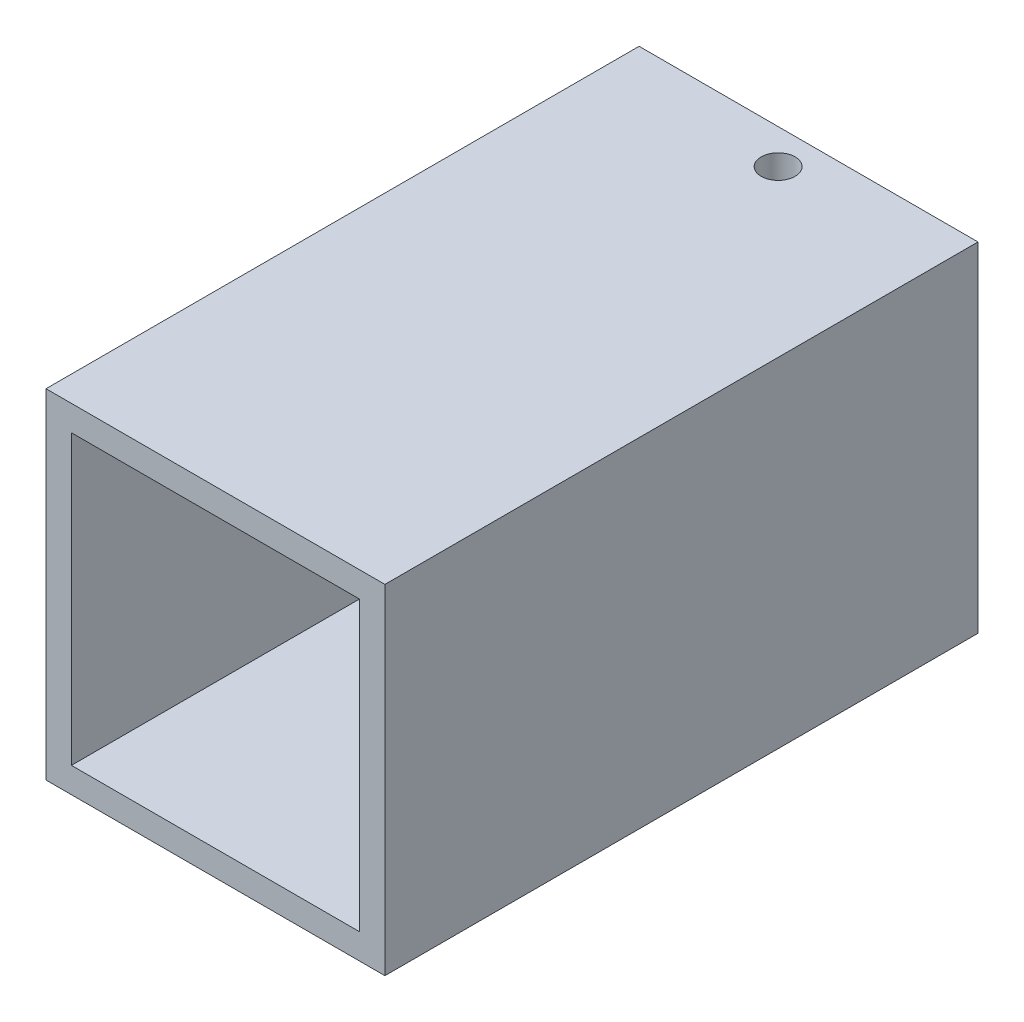
ISO-10303-21;
HEADER;
FILE_DESCRIPTION(('STEP AP214'),'2;1');
FILE_NAME('part.step','',(''),(''),'','','');
FILE_SCHEMA(('AUTOMOTIVE_DESIGN { 1 0 10303 214 1 1 1 1 }'));
ENDSEC;
DATA;
#1=APPLICATION_CONTEXT('core data for automotive mechanical design processes');
#2=APPLICATION_PROTOCOL_DEFINITION('international standard','automotive_design',2000,#1);
#3=PRODUCT_CONTEXT('',#1,'mechanical');
#4=PRODUCT('Part','Part','',(#3));
#5=PRODUCT_RELATED_PRODUCT_CATEGORY('part','',(#4));
#6=PRODUCT_DEFINITION_FORMATION('','',#4);
#7=PRODUCT_DEFINITION_CONTEXT('part definition',#1,'design');
#8=PRODUCT_DEFINITION('design','',#6,#7);
#9=PRODUCT_DEFINITION_SHAPE('','',#8);
#10=(LENGTH_UNIT() NAMED_UNIT(*) SI_UNIT(.MILLI.,.METRE.));
#11=(NAMED_UNIT(*) PLANE_ANGLE_UNIT() SI_UNIT($,.RADIAN.));
#12=(NAMED_UNIT(*) SI_UNIT($,.STERADIAN.) SOLID_ANGLE_UNIT());
#13=UNCERTAINTY_MEASURE_WITH_UNIT(LENGTH_MEASURE(1.E-05),#10,'distance_accuracy_value','');
#14=(GEOMETRIC_REPRESENTATION_CONTEXT(3) GLOBAL_UNCERTAINTY_ASSIGNED_CONTEXT((#13)) GLOBAL_UNIT_ASSIGNED_CONTEXT((#10,
#11,#12)) REPRESENTATION_CONTEXT('',''));
#15=CARTESIAN_POINT('',(0.,0.,0.));
#16=DIRECTION('',(0.,0.,1.));
#17=DIRECTION('',(1.,0.,0.));
#18=AXIS2_PLACEMENT_3D('',#15,#16,#17);
#19=CARTESIAN_POINT('',(0.,0.,35.));
#20=DIRECTION('',(0.,0.,-1.));
#21=DIRECTION('',(-1.,0.,0.));
#22=AXIS2_PLACEMENT_3D('',#19,#20,#21);
#23=PLANE('',#22);
#24=DIRECTION('',(-1.,0.,0.));
#25=VECTOR('',#24,1.);
#26=CARTESIAN_POINT('',(-30.422988866238,18.5,35.));
#27=LINE('',#26,#25);
#28=CARTESIAN_POINT('',(-10.422988866238,18.5,35.));
#29=VERTEX_POINT('',#28);
#30=CARTESIAN_POINT('',(-30.422988866238,18.5,35.));
#31=VERTEX_POINT('',#30);
#32=EDGE_CURVE('E137',#29,#31,#27,.T.);
#33=ORIENTED_EDGE('',*,*,#32,.T.);
#34=DIRECTION('',(0.,-1.,0.));
#35=VECTOR('',#34,1.);
#36=CARTESIAN_POINT('',(-30.422988866238,18.5,35.));
#37=LINE('',#36,#35);
#38=CARTESIAN_POINT('',(-30.422988866238,-1.5,35.));
#39=VERTEX_POINT('',#38);
#40=EDGE_CURVE('E140',#31,#39,#37,.T.);
#41=ORIENTED_EDGE('',*,*,#40,.T.);
#42=DIRECTION('',(1.,0.,0.));
#43=VECTOR('',#42,1.);
#44=CARTESIAN_POINT('',(-30.422988866238,-1.5,35.));
#45=LINE('',#44,#43);
#46=CARTESIAN_POINT('',(-10.422988866238,-1.5,35.));
#47=VERTEX_POINT('',#46);
#48=EDGE_CURVE('E143',#39,#47,#45,.T.);
#49=ORIENTED_EDGE('',*,*,#48,.T.);
#50=DIRECTION('',(0.,1.,0.));
#51=VECTOR('',#50,1.);
#52=CARTESIAN_POINT('',(-10.422988866238,18.5,35.));
#53=LINE('',#52,#51);
#54=EDGE_CURVE('E145',#47,#29,#53,.T.);
#55=ORIENTED_EDGE('',*,*,#54,.T.);
#56=EDGE_LOOP('',(#33,#41,#49,#55));
#57=FACE_BOUND('',#56,.T.);
#58=DIRECTION('',(0.,-1.,0.));
#59=VECTOR('',#58,1.);
#60=CARTESIAN_POINT('',(-28.922988866238,17.,35.));
#61=LINE('',#60,#59);
#62=CARTESIAN_POINT('',(-28.922988866238,17.,35.));
#63=VERTEX_POINT('',#62);
#64=CARTESIAN_POINT('',(-28.922988866238,0.,35.));
#65=VERTEX_POINT('',#64);
#66=EDGE_CURVE('E99',#63,#65,#61,.T.);
#67=ORIENTED_EDGE('',*,*,#66,.F.);
#68=DIRECTION('',(-1.,0.,0.));
#69=VECTOR('',#68,1.);
#70=CARTESIAN_POINT('',(-28.922988866238,17.,35.));
#71=LINE('',#70,#69);
#72=CARTESIAN_POINT('',(-11.922988866238,17.,35.));
#73=VERTEX_POINT('',#72);
#74=EDGE_CURVE('E121',#73,#63,#71,.T.);
#75=ORIENTED_EDGE('',*,*,#74,.F.);
#76=DIRECTION('',(0.,1.,0.));
#77=VECTOR('',#76,1.);
#78=CARTESIAN_POINT('',(-11.922988866238,17.,35.));
#79=LINE('',#78,#77);
#80=CARTESIAN_POINT('',(-11.922988866238,0.,35.));
#81=VERTEX_POINT('',#80);
#82=EDGE_CURVE('E119',#81,#73,#79,.T.);
#83=ORIENTED_EDGE('',*,*,#82,.F.);
#84=DIRECTION('',(1.,0.,0.));
#85=VECTOR('',#84,1.);
#86=CARTESIAN_POINT('',(-28.922988866238,0.,35.));
#87=LINE('',#86,#85);
#88=EDGE_CURVE('E107',#65,#81,#87,.T.);
#89=ORIENTED_EDGE('',*,*,#88,.F.);
#90=EDGE_LOOP('',(#67,#75,#83,#89));
#91=FACE_BOUND('',#90,.T.);
#92=ADVANCED_FACE('F33',(#57,#91),#23,.F.);
#93=CARTESIAN_POINT('',(0.,0.,0.));
#94=DIRECTION('',(0.,0.,-1.));
#95=DIRECTION('',(-1.,0.,0.));
#96=AXIS2_PLACEMENT_3D('',#93,#94,#95);
#97=PLANE('',#96);
#98=DIRECTION('',(-1.,0.,0.));
#99=VECTOR('',#98,1.);
#100=CARTESIAN_POINT('',(-30.422988866238,18.5,0.));
#101=LINE('',#100,#99);
#102=CARTESIAN_POINT('',(-10.422988866238,18.5,0.));
#103=VERTEX_POINT('',#102);
#104=CARTESIAN_POINT('',(-30.422988866238,18.5,0.));
#105=VERTEX_POINT('',#104);
#106=EDGE_CURVE('E115',#103,#105,#101,.T.);
#107=ORIENTED_EDGE('',*,*,#106,.F.);
#108=DIRECTION('',(0.,1.,0.));
#109=VECTOR('',#108,1.);
#110=CARTESIAN_POINT('',(-10.422988866238,18.5,0.));
#111=LINE('',#110,#109);
#112=CARTESIAN_POINT('',(-10.422988866238,-1.5,0.));
#113=VERTEX_POINT('',#112);
#114=EDGE_CURVE('E141',#113,#103,#111,.T.);
#115=ORIENTED_EDGE('',*,*,#114,.F.);
#116=DIRECTION('',(1.,0.,0.));
#117=VECTOR('',#116,1.);
#118=CARTESIAN_POINT('',(-30.422988866238,-1.5,0.));
#119=LINE('',#118,#117);
#120=CARTESIAN_POINT('',(-30.422988866238,-1.5,0.));
#121=VERTEX_POINT('',#120);
#122=EDGE_CURVE('E152',#121,#113,#119,.T.);
#123=ORIENTED_EDGE('',*,*,#122,.F.);
#124=DIRECTION('',(0.,-1.,0.));
#125=VECTOR('',#124,1.);
#126=CARTESIAN_POINT('',(-30.422988866238,18.5,0.));
#127=LINE('',#126,#125);
#128=EDGE_CURVE('E150',#105,#121,#127,.T.);
#129=ORIENTED_EDGE('',*,*,#128,.F.);
#130=EDGE_LOOP('',(#107,#115,#123,#129));
#131=FACE_BOUND('',#130,.T.);
#132=DIRECTION('',(-1.,0.,0.));
#133=VECTOR('',#132,1.);
#134=CARTESIAN_POINT('',(-28.922988866238,17.,0.));
#135=LINE('',#134,#133);
#136=CARTESIAN_POINT('',(-11.922988866238,17.,0.));
#137=VERTEX_POINT('',#136);
#138=CARTESIAN_POINT('',(-28.922988866238,17.,0.));
#139=VERTEX_POINT('',#138);
#140=EDGE_CURVE('E108',#137,#139,#135,.T.);
#141=ORIENTED_EDGE('',*,*,#140,.T.);
#142=DIRECTION('',(0.,-1.,0.));
#143=VECTOR('',#142,1.);
#144=CARTESIAN_POINT('',(-28.922988866238,17.,0.));
#145=LINE('',#144,#143);
#146=CARTESIAN_POINT('',(-28.922988866238,0.,0.));
#147=VERTEX_POINT('',#146);
#148=EDGE_CURVE('E57',#139,#147,#145,.T.);
#149=ORIENTED_EDGE('',*,*,#148,.T.);
#150=DIRECTION('',(1.,0.,0.));
#151=VECTOR('',#150,1.);
#152=CARTESIAN_POINT('',(-28.922988866238,0.,0.));
#153=LINE('',#152,#151);
#154=CARTESIAN_POINT('',(-11.922988866238,0.,0.));
#155=VERTEX_POINT('',#154);
#156=EDGE_CURVE('E114',#147,#155,#153,.T.);
#157=ORIENTED_EDGE('',*,*,#156,.T.);
#158=DIRECTION('',(0.,1.,0.));
#159=VECTOR('',#158,1.);
#160=CARTESIAN_POINT('',(-11.922988866238,17.,0.));
#161=LINE('',#160,#159);
#162=EDGE_CURVE('E129',#155,#137,#161,.T.);
#163=ORIENTED_EDGE('',*,*,#162,.T.);
#164=EDGE_LOOP('',(#141,#149,#157,#163));
#165=FACE_BOUND('',#164,.T.);
#166=ADVANCED_FACE('F171',(#131,#165),#97,.T.);
#167=CARTESIAN_POINT('',(-30.422988866238,18.5,35.));
#168=DIRECTION('',(0.,-1.,0.));
#169=DIRECTION('',(1.,0.,0.));
#170=AXIS2_PLACEMENT_3D('',#167,#168,#169);
#171=PLANE('',#170);
#172=CARTESIAN_POINT('',(-20.1716169837596,18.5,2.04638998269502));
#173=DIRECTION('',(0.,1.,0.));
#174=DIRECTION('',(-1.,0.,0.));
#175=AXIS2_PLACEMENT_3D('',#172,#173,#174);
#176=CIRCLE('',#175,1.);
#177=CARTESIAN_POINT('',(-21.1716169837596,18.5,2.04638998269502));
#178=VERTEX_POINT('',#177);
#179=EDGE_CURVE('E232',#178,#178,#176,.T.);
#180=ORIENTED_EDGE('',*,*,#179,.F.);
#181=EDGE_LOOP('',(#180));
#182=FACE_BOUND('',#181,.T.);
#183=ORIENTED_EDGE('',*,*,#106,.T.);
#184=DIRECTION('',(0.,0.,-1.));
#185=VECTOR('',#184,1.);
#186=CARTESIAN_POINT('',(-30.422988866238,18.5,35.));
#187=LINE('',#186,#185);
#188=EDGE_CURVE('E11',#31,#105,#187,.T.);
#189=ORIENTED_EDGE('',*,*,#188,.F.);
#190=ORIENTED_EDGE('',*,*,#32,.F.);
#191=DIRECTION('',(0.,0.,-1.));
#192=VECTOR('',#191,1.);
#193=CARTESIAN_POINT('',(-10.422988866238,18.5,35.));
#194=LINE('',#193,#192);
#195=EDGE_CURVE('E147',#29,#103,#194,.T.);
#196=ORIENTED_EDGE('',*,*,#195,.T.);
#197=EDGE_LOOP('',(#183,#189,#190,#196));
#198=FACE_BOUND('',#197,.T.);
#199=ADVANCED_FACE('F35',(#182,#198),#171,.F.);
#200=CARTESIAN_POINT('',(-30.422988866238,18.5,35.));
#201=DIRECTION('',(1.,0.,0.));
#202=DIRECTION('',(0.,1.,0.));
#203=AXIS2_PLACEMENT_3D('',#200,#201,#202);
#204=PLANE('',#203);
#205=ORIENTED_EDGE('',*,*,#128,.T.);
#206=DIRECTION('',(0.,0.,-1.));
#207=VECTOR('',#206,1.);
#208=CARTESIAN_POINT('',(-30.422988866238,-1.5,35.));
#209=LINE('',#208,#207);
#210=EDGE_CURVE('E42',#39,#121,#209,.T.);
#211=ORIENTED_EDGE('',*,*,#210,.F.);
#212=ORIENTED_EDGE('',*,*,#40,.F.);
#213=ORIENTED_EDGE('',*,*,#188,.T.);
#214=EDGE_LOOP('',(#205,#211,#212,#213));
#215=FACE_BOUND('',#214,.T.);
#216=ADVANCED_FACE('F181',(#215),#204,.F.);
#217=CARTESIAN_POINT('',(-30.422988866238,-1.5,35.));
#218=DIRECTION('',(0.,1.,0.));
#219=DIRECTION('',(0.,0.,1.));
#220=AXIS2_PLACEMENT_3D('',#217,#218,#219);
#221=PLANE('',#220);
#222=CARTESIAN_POINT('',(-20.1716169837596,-1.5,2.04638998269502));
#223=DIRECTION('',(0.,1.,0.));
#224=DIRECTION('',(-1.,0.,0.));
#225=AXIS2_PLACEMENT_3D('',#222,#223,#224);
#226=CIRCLE('',#225,1.);
#227=CARTESIAN_POINT('',(-21.1716169837596,-1.50000000000001,2.04638998269502));
#228=VERTEX_POINT('',#227);
#229=EDGE_CURVE('E233',#228,#228,#226,.T.);
#230=ORIENTED_EDGE('',*,*,#229,.T.);
#231=EDGE_LOOP('',(#230));
#232=FACE_BOUND('',#231,.T.);
#233=ORIENTED_EDGE('',*,*,#122,.T.);
#234=DIRECTION('',(0.,0.,-1.));
#235=VECTOR('',#234,1.);
#236=CARTESIAN_POINT('',(-10.422988866238,-1.5,35.));
#237=LINE('',#236,#235);
#238=EDGE_CURVE('E157',#47,#113,#237,.T.);
#239=ORIENTED_EDGE('',*,*,#238,.F.);
#240=ORIENTED_EDGE('',*,*,#48,.F.);
#241=ORIENTED_EDGE('',*,*,#210,.T.);
#242=EDGE_LOOP('',(#233,#239,#240,#241));
#243=FACE_BOUND('',#242,.T.);
#244=ADVANCED_FACE('F165',(#232,#243),#221,.F.);
#245=CARTESIAN_POINT('',(-10.422988866238,18.5,35.));
#246=DIRECTION('',(-1.,0.,0.));
#247=DIRECTION('',(0.,-1.,0.));
#248=AXIS2_PLACEMENT_3D('',#245,#246,#247);
#249=PLANE('',#248);
#250=ORIENTED_EDGE('',*,*,#114,.T.);
#251=ORIENTED_EDGE('',*,*,#195,.F.);
#252=ORIENTED_EDGE('',*,*,#54,.F.);
#253=ORIENTED_EDGE('',*,*,#238,.T.);
#254=EDGE_LOOP('',(#250,#251,#252,#253));
#255=FACE_BOUND('',#254,.T.);
#256=ADVANCED_FACE('F175',(#255),#249,.F.);
#257=CARTESIAN_POINT('',(-28.922988866238,17.,35.));
#258=DIRECTION('',(1.,0.,0.));
#259=DIRECTION('',(0.,1.,0.));
#260=AXIS2_PLACEMENT_3D('',#257,#258,#259);
#261=PLANE('',#260);
#262=ORIENTED_EDGE('',*,*,#148,.F.);
#263=DIRECTION('',(0.,0.,-1.));
#264=VECTOR('',#263,1.);
#265=CARTESIAN_POINT('',(-28.922988866238,17.,35.));
#266=LINE('',#265,#264);
#267=EDGE_CURVE('E103',#63,#139,#266,.T.);
#268=ORIENTED_EDGE('',*,*,#267,.F.);
#269=ORIENTED_EDGE('',*,*,#66,.T.);
#270=DIRECTION('',(0.,0.,-1.));
#271=VECTOR('',#270,1.);
#272=CARTESIAN_POINT('',(-28.922988866238,0.,35.));
#273=LINE('',#272,#271);
#274=EDGE_CURVE('E102',#65,#147,#273,.T.);
#275=ORIENTED_EDGE('',*,*,#274,.T.);
#276=EDGE_LOOP('',(#262,#268,#269,#275));
#277=FACE_BOUND('',#276,.T.);
#278=ADVANCED_FACE('F101',(#277),#261,.T.);
#279=CARTESIAN_POINT('',(-28.922988866238,0.,35.));
#280=DIRECTION('',(0.,1.,0.));
#281=DIRECTION('',(0.,0.,1.));
#282=AXIS2_PLACEMENT_3D('',#279,#280,#281);
#283=PLANE('',#282);
#284=CARTESIAN_POINT('',(-20.1716169837596,0.,2.04638998269502));
#285=DIRECTION('',(0.,1.,0.));
#286=DIRECTION('',(0.,0.,1.));
#287=AXIS2_PLACEMENT_3D('',#284,#285,#286);
#288=CIRCLE('',#287,1.);
#289=CARTESIAN_POINT('',(-20.1716169837596,0.,3.04638998269502));
#290=VERTEX_POINT('',#289);
#291=EDGE_CURVE('E127',#290,#290,#288,.T.);
#292=ORIENTED_EDGE('',*,*,#291,.F.);
#293=EDGE_LOOP('',(#292));
#294=FACE_BOUND('',#293,.T.);
#295=ORIENTED_EDGE('',*,*,#156,.F.);
#296=ORIENTED_EDGE('',*,*,#274,.F.);
#297=ORIENTED_EDGE('',*,*,#88,.T.);
#298=DIRECTION('',(0.,0.,-1.));
#299=VECTOR('',#298,1.);
#300=CARTESIAN_POINT('',(-11.922988866238,0.,35.));
#301=LINE('',#300,#299);
#302=EDGE_CURVE('E116',#81,#155,#301,.T.);
#303=ORIENTED_EDGE('',*,*,#302,.T.);
#304=EDGE_LOOP('',(#295,#296,#297,#303));
#305=FACE_BOUND('',#304,.T.);
#306=ADVANCED_FACE('F111',(#294,#305),#283,.T.);
#307=CARTESIAN_POINT('',(-11.922988866238,17.,35.));
#308=DIRECTION('',(-1.,0.,0.));
#309=DIRECTION('',(0.,-1.,0.));
#310=AXIS2_PLACEMENT_3D('',#307,#308,#309);
#311=PLANE('',#310);
#312=ORIENTED_EDGE('',*,*,#162,.F.);
#313=ORIENTED_EDGE('',*,*,#302,.F.);
#314=ORIENTED_EDGE('',*,*,#82,.T.);
#315=DIRECTION('',(0.,0.,-1.));
#316=VECTOR('',#315,1.);
#317=CARTESIAN_POINT('',(-11.922988866238,17.,35.));
#318=LINE('',#317,#316);
#319=EDGE_CURVE('E49',#73,#137,#318,.T.);
#320=ORIENTED_EDGE('',*,*,#319,.T.);
#321=EDGE_LOOP('',(#312,#313,#314,#320));
#322=FACE_BOUND('',#321,.T.);
#323=ADVANCED_FACE('F206',(#322),#311,.T.);
#324=CARTESIAN_POINT('',(-28.922988866238,17.,35.));
#325=DIRECTION('',(0.,-1.,0.));
#326=DIRECTION('',(0.,0.,-1.));
#327=AXIS2_PLACEMENT_3D('',#324,#325,#326);
#328=PLANE('',#327);
#329=CARTESIAN_POINT('',(-20.1716169837596,17.,2.04638998269502));
#330=DIRECTION('',(0.,-1.,0.));
#331=DIRECTION('',(0.,0.,-1.));
#332=AXIS2_PLACEMENT_3D('',#329,#330,#331);
#333=CIRCLE('',#332,1.);
#334=CARTESIAN_POINT('',(-20.1716169837596,17.,1.04638998269502));
#335=VERTEX_POINT('',#334);
#336=EDGE_CURVE('E37',#335,#335,#333,.T.);
#337=ORIENTED_EDGE('',*,*,#336,.F.);
#338=EDGE_LOOP('',(#337));
#339=FACE_BOUND('',#338,.T.);
#340=ORIENTED_EDGE('',*,*,#140,.F.);
#341=ORIENTED_EDGE('',*,*,#319,.F.);
#342=ORIENTED_EDGE('',*,*,#74,.T.);
#343=ORIENTED_EDGE('',*,*,#267,.T.);
#344=EDGE_LOOP('',(#340,#341,#342,#343));
#345=FACE_BOUND('',#344,.T.);
#346=ADVANCED_FACE('F211',(#339,#345),#328,.T.);
#347=CARTESIAN_POINT('',(-20.1716169837596,-1.5,2.04638998269502));
#348=DIRECTION('',(0.,1.,0.));
#349=DIRECTION('',(-1.,0.,0.));
#350=AXIS2_PLACEMENT_3D('',#347,#348,#349);
#351=CYLINDRICAL_SURFACE('',#350,1.);
#352=ORIENTED_EDGE('',*,*,#336,.T.);
#353=EDGE_LOOP('',(#352));
#354=FACE_BOUND('',#353,.T.);
#355=ORIENTED_EDGE('',*,*,#179,.T.);
#356=EDGE_LOOP('',(#355));
#357=FACE_BOUND('',#356,.T.);
#358=ADVANCED_FACE('F218',(#354,#357),#351,.F.);
#359=ORIENTED_EDGE('',*,*,#291,.T.);
#360=EDGE_LOOP('',(#359));
#361=FACE_BOUND('',#360,.T.);
#362=ORIENTED_EDGE('',*,*,#229,.F.);
#363=EDGE_LOOP('',(#362));
#364=FACE_BOUND('',#363,.T.);
#365=ADVANCED_FACE('F221',(#361,#364),#351,.F.);
#366=CLOSED_SHELL('',(#92,#166,#199,#216,#244,#256,#278,#306,#323,#346,#358,#365));
#367=MANIFOLD_SOLID_BREP('B2',#366);
#368=ADVANCED_BREP_SHAPE_REPRESENTATION('',(#18,#367),#14);
#369=SHAPE_DEFINITION_REPRESENTATION(#9,#368);
ENDSEC;
END-ISO-10303-21;
